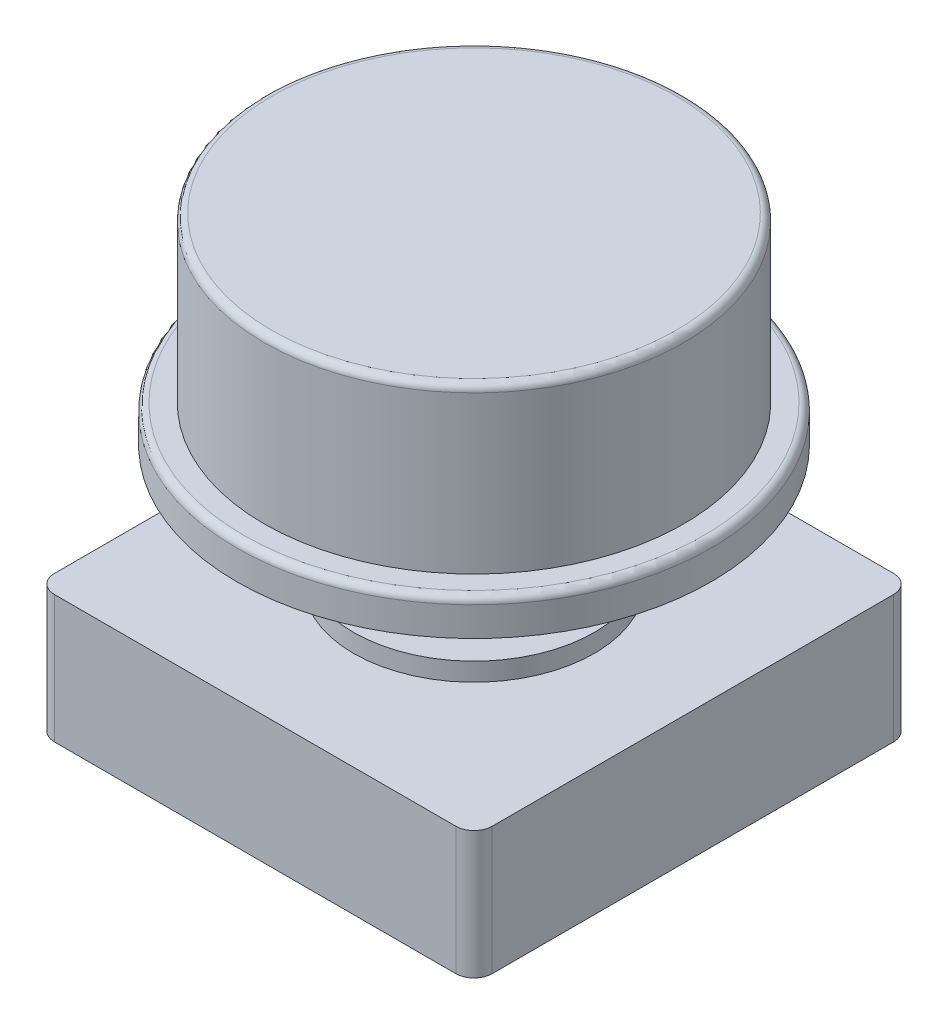
ISO-10303-21;
HEADER;
FILE_DESCRIPTION(('STEP AP214'),'2;1');
FILE_NAME('part.step','',(''),(''),'','','');
FILE_SCHEMA(('AUTOMOTIVE_DESIGN { 1 0 10303 214 1 1 1 1 }'));
ENDSEC;
DATA;
#1=APPLICATION_CONTEXT('core data for automotive mechanical design processes');
#2=APPLICATION_PROTOCOL_DEFINITION('international standard','automotive_design',2000,#1);
#3=PRODUCT_CONTEXT('',#1,'mechanical');
#4=PRODUCT('Part','Part','',(#3));
#5=PRODUCT_RELATED_PRODUCT_CATEGORY('part','',(#4));
#6=PRODUCT_DEFINITION_FORMATION('','',#4);
#7=PRODUCT_DEFINITION_CONTEXT('part definition',#1,'design');
#8=PRODUCT_DEFINITION('design','',#6,#7);
#9=PRODUCT_DEFINITION_SHAPE('','',#8);
#10=(LENGTH_UNIT() NAMED_UNIT(*) SI_UNIT(.MILLI.,.METRE.));
#11=(NAMED_UNIT(*) PLANE_ANGLE_UNIT() SI_UNIT($,.RADIAN.));
#12=(NAMED_UNIT(*) SI_UNIT($,.STERADIAN.) SOLID_ANGLE_UNIT());
#13=UNCERTAINTY_MEASURE_WITH_UNIT(LENGTH_MEASURE(1.E-05),#10,'distance_accuracy_value','');
#14=(GEOMETRIC_REPRESENTATION_CONTEXT(3) GLOBAL_UNCERTAINTY_ASSIGNED_CONTEXT((#13)) GLOBAL_UNIT_ASSIGNED_CONTEXT((#10,
#11,#12)) REPRESENTATION_CONTEXT('',''));
#15=CARTESIAN_POINT('',(0.,0.,0.));
#16=DIRECTION('',(0.,0.,1.));
#17=DIRECTION('',(1.,0.,0.));
#18=AXIS2_PLACEMENT_3D('',#15,#16,#17);
#19=CARTESIAN_POINT('',(-11.5,3.5,-0.499999999999999));
#20=DIRECTION('',(0.,-1.,0.));
#21=DIRECTION('',(0.,0.,-1.));
#22=AXIS2_PLACEMENT_3D('',#19,#20,#21);
#23=CYLINDRICAL_SURFACE('',#22,0.5);
#24=CARTESIAN_POINT('',(-11.5,0.,-0.499999999999999));
#25=DIRECTION('',(0.,-1.,0.));
#26=DIRECTION('',(0.,0.,-1.));
#27=AXIS2_PLACEMENT_3D('',#24,#25,#26);
#28=CIRCLE('',#27,0.5);
#29=CARTESIAN_POINT('',(-11.5,0.,0.));
#30=VERTEX_POINT('',#29);
#31=CARTESIAN_POINT('',(-12.,0.,-0.500000000000002));
#32=VERTEX_POINT('',#31);
#33=EDGE_CURVE('E163',#30,#32,#28,.T.);
#34=ORIENTED_EDGE('',*,*,#33,.F.);
#35=DIRECTION('',(0.,-1.,0.));
#36=VECTOR('',#35,1.);
#37=CARTESIAN_POINT('',(-11.5,3.5,0.));
#38=LINE('',#37,#36);
#39=CARTESIAN_POINT('',(-11.5,3.5,0.));
#40=VERTEX_POINT('',#39);
#41=EDGE_CURVE('E168',#40,#30,#38,.T.);
#42=ORIENTED_EDGE('',*,*,#41,.F.);
#43=CARTESIAN_POINT('',(-11.5,3.5,-0.499999999999999));
#44=DIRECTION('',(0.,-1.,0.));
#45=DIRECTION('',(0.,0.,-1.));
#46=AXIS2_PLACEMENT_3D('',#43,#44,#45);
#47=CIRCLE('',#46,0.5);
#48=CARTESIAN_POINT('',(-12.,3.5,-0.500000000000002));
#49=VERTEX_POINT('',#48);
#50=EDGE_CURVE('E169',#40,#49,#47,.T.);
#51=ORIENTED_EDGE('',*,*,#50,.T.);
#52=DIRECTION('',(0.,-1.,0.));
#53=VECTOR('',#52,1.);
#54=CARTESIAN_POINT('',(-12.,3.5,-0.500000000000002));
#55=LINE('',#54,#53);
#56=EDGE_CURVE('E190',#49,#32,#55,.T.);
#57=ORIENTED_EDGE('',*,*,#56,.T.);
#58=EDGE_LOOP('',(#34,#42,#51,#57));
#59=FACE_BOUND('',#58,.T.);
#60=ADVANCED_FACE('F33',(#59),#23,.T.);
#61=CARTESIAN_POINT('',(-0.500000000000004,3.5,0.));
#62=DIRECTION('',(0.,0.,1.));
#63=DIRECTION('',(1.,0.,0.));
#64=AXIS2_PLACEMENT_3D('',#61,#62,#63);
#65=PLANE('',#64);
#66=DIRECTION('',(-1.,0.,0.));
#67=VECTOR('',#66,1.);
#68=CARTESIAN_POINT('',(-0.500000000000004,0.,0.));
#69=LINE('',#68,#67);
#70=CARTESIAN_POINT('',(-0.500000000000004,0.,0.));
#71=VERTEX_POINT('',#70);
#72=EDGE_CURVE('E173',#71,#30,#69,.T.);
#73=ORIENTED_EDGE('',*,*,#72,.F.);
#74=DIRECTION('',(0.,-1.,0.));
#75=VECTOR('',#74,1.);
#76=CARTESIAN_POINT('',(-0.500000000000004,3.5,0.));
#77=LINE('',#76,#75);
#78=CARTESIAN_POINT('',(-0.500000000000004,3.5,0.));
#79=VERTEX_POINT('',#78);
#80=EDGE_CURVE('E212',#79,#71,#77,.T.);
#81=ORIENTED_EDGE('',*,*,#80,.F.);
#82=DIRECTION('',(-1.,0.,0.));
#83=VECTOR('',#82,1.);
#84=CARTESIAN_POINT('',(-0.500000000000004,3.5,0.));
#85=LINE('',#84,#83);
#86=EDGE_CURVE('E187',#79,#40,#85,.T.);
#87=ORIENTED_EDGE('',*,*,#86,.T.);
#88=ORIENTED_EDGE('',*,*,#41,.T.);
#89=EDGE_LOOP('',(#73,#81,#87,#88));
#90=FACE_BOUND('',#89,.T.);
#91=ADVANCED_FACE('F246',(#90),#65,.T.);
#92=CARTESIAN_POINT('',(-0.5,3.5,-0.5));
#93=DIRECTION('',(0.,-1.,0.));
#94=DIRECTION('',(0.,0.,-1.));
#95=AXIS2_PLACEMENT_3D('',#92,#93,#94);
#96=CYLINDRICAL_SURFACE('',#95,0.5);
#97=CARTESIAN_POINT('',(-0.5,0.,-0.5));
#98=DIRECTION('',(0.,1.,0.));
#99=DIRECTION('',(0.,0.,1.));
#100=AXIS2_PLACEMENT_3D('',#97,#98,#99);
#101=CIRCLE('',#100,0.5);
#102=CARTESIAN_POINT('',(0.,0.,-0.500000000000004));
#103=VERTEX_POINT('',#102);
#104=EDGE_CURVE('E207',#71,#103,#101,.T.);
#105=ORIENTED_EDGE('',*,*,#104,.T.);
#106=DIRECTION('',(0.,-1.,0.));
#107=VECTOR('',#106,1.);
#108=CARTESIAN_POINT('',(0.,3.5,-0.500000000000004));
#109=LINE('',#108,#107);
#110=CARTESIAN_POINT('',(0.,3.5,-0.500000000000004));
#111=VERTEX_POINT('',#110);
#112=EDGE_CURVE('E214',#111,#103,#109,.T.);
#113=ORIENTED_EDGE('',*,*,#112,.F.);
#114=CARTESIAN_POINT('',(-0.5,3.5,-0.5));
#115=DIRECTION('',(0.,1.,0.));
#116=DIRECTION('',(0.,0.,1.));
#117=AXIS2_PLACEMENT_3D('',#114,#115,#116);
#118=CIRCLE('',#117,0.5);
#119=EDGE_CURVE('E185',#79,#111,#118,.T.);
#120=ORIENTED_EDGE('',*,*,#119,.F.);
#121=ORIENTED_EDGE('',*,*,#80,.T.);
#122=EDGE_LOOP('',(#105,#113,#120,#121));
#123=FACE_BOUND('',#122,.T.);
#124=ADVANCED_FACE('F252',(#123),#96,.T.);
#125=CARTESIAN_POINT('',(0.,3.5,-0.500000000000004));
#126=DIRECTION('',(-1.,0.,0.));
#127=DIRECTION('',(0.,0.,1.));
#128=AXIS2_PLACEMENT_3D('',#125,#126,#127);
#129=PLANE('',#128);
#130=DIRECTION('',(0.,0.,-1.));
#131=VECTOR('',#130,1.);
#132=CARTESIAN_POINT('',(0.,0.,-0.500000000000004));
#133=LINE('',#132,#131);
#134=CARTESIAN_POINT('',(0.,0.,-11.5));
#135=VERTEX_POINT('',#134);
#136=EDGE_CURVE('E204',#103,#135,#133,.T.);
#137=ORIENTED_EDGE('',*,*,#136,.T.);
#138=DIRECTION('',(0.,-1.,0.));
#139=VECTOR('',#138,1.);
#140=CARTESIAN_POINT('',(0.,3.5,-11.5));
#141=LINE('',#140,#139);
#142=CARTESIAN_POINT('',(0.,3.5,-11.5));
#143=VERTEX_POINT('',#142);
#144=EDGE_CURVE('E217',#143,#135,#141,.T.);
#145=ORIENTED_EDGE('',*,*,#144,.F.);
#146=DIRECTION('',(0.,0.,-1.));
#147=VECTOR('',#146,1.);
#148=CARTESIAN_POINT('',(0.,3.5,-0.500000000000004));
#149=LINE('',#148,#147);
#150=EDGE_CURVE('E183',#111,#143,#149,.T.);
#151=ORIENTED_EDGE('',*,*,#150,.F.);
#152=ORIENTED_EDGE('',*,*,#112,.T.);
#153=EDGE_LOOP('',(#137,#145,#151,#152));
#154=FACE_BOUND('',#153,.T.);
#155=ADVANCED_FACE('F273',(#154),#129,.F.);
#156=CARTESIAN_POINT('',(-0.5,3.5,-11.5));
#157=DIRECTION('',(0.,-1.,0.));
#158=DIRECTION('',(0.,0.,-1.));
#159=AXIS2_PLACEMENT_3D('',#156,#157,#158);
#160=CYLINDRICAL_SURFACE('',#159,0.5);
#161=CARTESIAN_POINT('',(-0.5,0.,-11.5));
#162=DIRECTION('',(0.,-1.,0.));
#163=DIRECTION('',(0.,0.,-1.));
#164=AXIS2_PLACEMENT_3D('',#161,#162,#163);
#165=CIRCLE('',#164,0.5);
#166=CARTESIAN_POINT('',(-0.500000000000004,0.,-12.));
#167=VERTEX_POINT('',#166);
#168=EDGE_CURVE('E201',#167,#135,#165,.T.);
#169=ORIENTED_EDGE('',*,*,#168,.F.);
#170=DIRECTION('',(0.,-1.,0.));
#171=VECTOR('',#170,1.);
#172=CARTESIAN_POINT('',(-0.500000000000004,3.5,-12.));
#173=LINE('',#172,#171);
#174=CARTESIAN_POINT('',(-0.500000000000004,3.5,-12.));
#175=VERTEX_POINT('',#174);
#176=EDGE_CURVE('E219',#175,#167,#173,.T.);
#177=ORIENTED_EDGE('',*,*,#176,.F.);
#178=CARTESIAN_POINT('',(-0.5,3.5,-11.5));
#179=DIRECTION('',(0.,-1.,0.));
#180=DIRECTION('',(0.,0.,-1.));
#181=AXIS2_PLACEMENT_3D('',#178,#179,#180);
#182=CIRCLE('',#181,0.5);
#183=EDGE_CURVE('E180',#175,#143,#182,.T.);
#184=ORIENTED_EDGE('',*,*,#183,.T.);
#185=ORIENTED_EDGE('',*,*,#144,.T.);
#186=EDGE_LOOP('',(#169,#177,#184,#185));
#187=FACE_BOUND('',#186,.T.);
#188=ADVANCED_FACE('F269',(#187),#160,.T.);
#189=CARTESIAN_POINT('',(-0.500000000000004,3.5,-12.));
#190=DIRECTION('',(0.,0.,1.));
#191=DIRECTION('',(1.,0.,0.));
#192=AXIS2_PLACEMENT_3D('',#189,#190,#191);
#193=PLANE('',#192);
#194=DIRECTION('',(-1.,0.,0.));
#195=VECTOR('',#194,1.);
#196=CARTESIAN_POINT('',(-0.500000000000004,0.,-12.));
#197=LINE('',#196,#195);
#198=CARTESIAN_POINT('',(-11.5,0.,-12.));
#199=VERTEX_POINT('',#198);
#200=EDGE_CURVE('E199',#167,#199,#197,.T.);
#201=ORIENTED_EDGE('',*,*,#200,.T.);
#202=DIRECTION('',(0.,-1.,0.));
#203=VECTOR('',#202,1.);
#204=CARTESIAN_POINT('',(-11.5,3.5,-12.));
#205=LINE('',#204,#203);
#206=CARTESIAN_POINT('',(-11.5,3.5,-12.));
#207=VERTEX_POINT('',#206);
#208=EDGE_CURVE('E221',#207,#199,#205,.T.);
#209=ORIENTED_EDGE('',*,*,#208,.F.);
#210=DIRECTION('',(-1.,0.,0.));
#211=VECTOR('',#210,1.);
#212=CARTESIAN_POINT('',(-0.500000000000004,3.5,-12.));
#213=LINE('',#212,#211);
#214=EDGE_CURVE('E178',#175,#207,#213,.T.);
#215=ORIENTED_EDGE('',*,*,#214,.F.);
#216=ORIENTED_EDGE('',*,*,#176,.T.);
#217=EDGE_LOOP('',(#201,#209,#215,#216));
#218=FACE_BOUND('',#217,.T.);
#219=ADVANCED_FACE('F265',(#218),#193,.F.);
#220=CARTESIAN_POINT('',(-11.5,3.5,-11.5));
#221=DIRECTION('',(0.,-1.,0.));
#222=DIRECTION('',(0.,0.,-1.));
#223=AXIS2_PLACEMENT_3D('',#220,#221,#222);
#224=CYLINDRICAL_SURFACE('',#223,0.5);
#225=CARTESIAN_POINT('',(-11.5,0.,-11.5));
#226=DIRECTION('',(0.,1.,0.));
#227=DIRECTION('',(0.,0.,1.));
#228=AXIS2_PLACEMENT_3D('',#225,#226,#227);
#229=CIRCLE('',#228,0.5);
#230=CARTESIAN_POINT('',(-12.,0.,-11.5));
#231=VERTEX_POINT('',#230);
#232=EDGE_CURVE('E196',#199,#231,#229,.T.);
#233=ORIENTED_EDGE('',*,*,#232,.T.);
#234=DIRECTION('',(0.,-1.,0.));
#235=VECTOR('',#234,1.);
#236=CARTESIAN_POINT('',(-12.,3.5,-11.5));
#237=LINE('',#236,#235);
#238=CARTESIAN_POINT('',(-12.,3.5,-11.5));
#239=VERTEX_POINT('',#238);
#240=EDGE_CURVE('E224',#239,#231,#237,.T.);
#241=ORIENTED_EDGE('',*,*,#240,.F.);
#242=CARTESIAN_POINT('',(-11.5,3.5,-11.5));
#243=DIRECTION('',(0.,1.,0.));
#244=DIRECTION('',(0.,0.,1.));
#245=AXIS2_PLACEMENT_3D('',#242,#243,#244);
#246=CIRCLE('',#245,0.5);
#247=EDGE_CURVE('E176',#207,#239,#246,.T.);
#248=ORIENTED_EDGE('',*,*,#247,.F.);
#249=ORIENTED_EDGE('',*,*,#208,.T.);
#250=EDGE_LOOP('',(#233,#241,#248,#249));
#251=FACE_BOUND('',#250,.T.);
#252=ADVANCED_FACE('F261',(#251),#224,.T.);
#253=CARTESIAN_POINT('',(-12.,3.5,-0.500000000000002));
#254=DIRECTION('',(-1.,0.,0.));
#255=DIRECTION('',(0.,0.,1.));
#256=AXIS2_PLACEMENT_3D('',#253,#254,#255);
#257=PLANE('',#256);
#258=DIRECTION('',(0.,0.,-1.));
#259=VECTOR('',#258,1.);
#260=CARTESIAN_POINT('',(-12.,0.,-0.500000000000002));
#261=LINE('',#260,#259);
#262=EDGE_CURVE('E193',#32,#231,#261,.T.);
#263=ORIENTED_EDGE('',*,*,#262,.F.);
#264=ORIENTED_EDGE('',*,*,#56,.F.);
#265=DIRECTION('',(0.,0.,-1.));
#266=VECTOR('',#265,1.);
#267=CARTESIAN_POINT('',(-12.,3.5,-0.500000000000002));
#268=LINE('',#267,#266);
#269=EDGE_CURVE('E172',#49,#239,#268,.T.);
#270=ORIENTED_EDGE('',*,*,#269,.T.);
#271=ORIENTED_EDGE('',*,*,#240,.T.);
#272=EDGE_LOOP('',(#263,#264,#270,#271));
#273=FACE_BOUND('',#272,.T.);
#274=ADVANCED_FACE('F257',(#273),#257,.T.);
#275=CARTESIAN_POINT('',(-11.5,3.5,-0.499999999999999));
#276=DIRECTION('',(0.,-1.,0.));
#277=DIRECTION('',(0.,0.,-1.));
#278=AXIS2_PLACEMENT_3D('',#275,#276,#277);
#279=PLANE('',#278);
#280=CARTESIAN_POINT('',(-6.,3.5,-6.));
#281=DIRECTION('',(0.,1.,0.));
#282=DIRECTION('',(0.,0.,1.));
#283=AXIS2_PLACEMENT_3D('',#280,#281,#282);
#284=CIRCLE('',#283,3.3);
#285=CARTESIAN_POINT('',(-6.,3.5,-2.7));
#286=VERTEX_POINT('',#285);
#287=EDGE_CURVE('E164',#286,#286,#284,.T.);
#288=ORIENTED_EDGE('',*,*,#287,.F.);
#289=EDGE_LOOP('',(#288));
#290=FACE_BOUND('',#289,.T.);
#291=ORIENTED_EDGE('',*,*,#50,.F.);
#292=ORIENTED_EDGE('',*,*,#86,.F.);
#293=ORIENTED_EDGE('',*,*,#119,.T.);
#294=ORIENTED_EDGE('',*,*,#150,.T.);
#295=ORIENTED_EDGE('',*,*,#183,.F.);
#296=ORIENTED_EDGE('',*,*,#214,.T.);
#297=ORIENTED_EDGE('',*,*,#247,.T.);
#298=ORIENTED_EDGE('',*,*,#269,.F.);
#299=EDGE_LOOP('',(#291,#292,#293,#294,#295,#296,#297,#298));
#300=FACE_BOUND('',#299,.T.);
#301=ADVANCED_FACE('F260',(#290,#300),#279,.F.);
#302=CARTESIAN_POINT('',(-11.5,0.,-0.499999999999999));
#303=DIRECTION('',(0.,-1.,0.));
#304=DIRECTION('',(0.,0.,-1.));
#305=AXIS2_PLACEMENT_3D('',#302,#303,#304);
#306=PLANE('',#305);
#307=ORIENTED_EDGE('',*,*,#33,.T.);
#308=ORIENTED_EDGE('',*,*,#262,.T.);
#309=ORIENTED_EDGE('',*,*,#232,.F.);
#310=ORIENTED_EDGE('',*,*,#200,.F.);
#311=ORIENTED_EDGE('',*,*,#168,.T.);
#312=ORIENTED_EDGE('',*,*,#136,.F.);
#313=ORIENTED_EDGE('',*,*,#104,.F.);
#314=ORIENTED_EDGE('',*,*,#72,.T.);
#315=EDGE_LOOP('',(#307,#308,#309,#310,#311,#312,#313,#314));
#316=FACE_BOUND('',#315,.T.);
#317=ADVANCED_FACE('F281',(#316),#306,.T.);
#318=CARTESIAN_POINT('',(-6.,4.,-6.));
#319=DIRECTION('',(0.,-1.,0.));
#320=DIRECTION('',(0.,0.,-1.));
#321=AXIS2_PLACEMENT_3D('',#318,#319,#320);
#322=CYLINDRICAL_SURFACE('',#321,3.3);
#323=CARTESIAN_POINT('',(-6.,4.,-6.));
#324=DIRECTION('',(0.,1.,0.));
#325=DIRECTION('',(0.,0.,1.));
#326=AXIS2_PLACEMENT_3D('',#323,#324,#325);
#327=CIRCLE('',#326,3.3);
#328=CARTESIAN_POINT('',(-6.,4.,-2.7));
#329=VERTEX_POINT('',#328);
#330=EDGE_CURVE('E160',#329,#329,#327,.T.);
#331=ORIENTED_EDGE('',*,*,#330,.F.);
#332=EDGE_LOOP('',(#331));
#333=FACE_BOUND('',#332,.T.);
#334=ORIENTED_EDGE('',*,*,#287,.T.);
#335=EDGE_LOOP('',(#334));
#336=FACE_BOUND('',#335,.T.);
#337=ADVANCED_FACE('F284',(#333,#336),#322,.T.);
#338=CARTESIAN_POINT('',(-6.,4.,-6.));
#339=DIRECTION('',(0.,1.,0.));
#340=DIRECTION('',(0.,0.,1.));
#341=AXIS2_PLACEMENT_3D('',#338,#339,#340);
#342=PLANE('',#341);
#343=DIRECTION('',(0.,0.,1.));
#344=VECTOR('',#343,1.);
#345=CARTESIAN_POINT('',(-7.5,4.,-7.5));
#346=LINE('',#345,#344);
#347=CARTESIAN_POINT('',(-7.5,4.,-7.5));
#348=VERTEX_POINT('',#347);
#349=CARTESIAN_POINT('',(-7.5,4.,-4.5));
#350=VERTEX_POINT('',#349);
#351=EDGE_CURVE('E48',#348,#350,#346,.T.);
#352=ORIENTED_EDGE('',*,*,#351,.F.);
#353=DIRECTION('',(-1.,0.,0.));
#354=VECTOR('',#353,1.);
#355=CARTESIAN_POINT('',(-7.5,4.,-7.5));
#356=LINE('',#355,#354);
#357=CARTESIAN_POINT('',(-4.5,4.,-7.5));
#358=VERTEX_POINT('',#357);
#359=EDGE_CURVE('E52',#358,#348,#356,.T.);
#360=ORIENTED_EDGE('',*,*,#359,.F.);
#361=DIRECTION('',(0.,0.,-1.));
#362=VECTOR('',#361,1.);
#363=CARTESIAN_POINT('',(-4.5,4.,-7.5));
#364=LINE('',#363,#362);
#365=CARTESIAN_POINT('',(-4.5,4.,-4.5));
#366=VERTEX_POINT('',#365);
#367=EDGE_CURVE('E152',#366,#358,#364,.T.);
#368=ORIENTED_EDGE('',*,*,#367,.F.);
#369=DIRECTION('',(1.,0.,0.));
#370=VECTOR('',#369,1.);
#371=CARTESIAN_POINT('',(-7.5,4.,-4.5));
#372=LINE('',#371,#370);
#373=EDGE_CURVE('E148',#350,#366,#372,.T.);
#374=ORIENTED_EDGE('',*,*,#373,.F.);
#375=EDGE_LOOP('',(#352,#360,#368,#374));
#376=FACE_BOUND('',#375,.T.);
#377=ORIENTED_EDGE('',*,*,#330,.T.);
#378=EDGE_LOOP('',(#377));
#379=FACE_BOUND('',#378,.T.);
#380=ADVANCED_FACE('F291',(#376,#379),#342,.T.);
#381=CARTESIAN_POINT('',(-7.5,6.8,-7.5));
#382=DIRECTION('',(1.,0.,0.));
#383=DIRECTION('',(0.,0.,-1.));
#384=AXIS2_PLACEMENT_3D('',#381,#382,#383);
#385=PLANE('',#384);
#386=ORIENTED_EDGE('',*,*,#351,.T.);
#387=DIRECTION('',(0.,-1.,0.));
#388=VECTOR('',#387,1.);
#389=CARTESIAN_POINT('',(-7.5,6.8,-4.5));
#390=LINE('',#389,#388);
#391=CARTESIAN_POINT('',(-7.5,6.8,-4.5));
#392=VERTEX_POINT('',#391);
#393=EDGE_CURVE('E126',#392,#350,#390,.T.);
#394=ORIENTED_EDGE('',*,*,#393,.F.);
#395=DIRECTION('',(0.,0.,1.));
#396=VECTOR('',#395,1.);
#397=CARTESIAN_POINT('',(-7.5,6.8,-7.5));
#398=LINE('',#397,#396);
#399=CARTESIAN_POINT('',(-7.5,6.8,-7.5));
#400=VERTEX_POINT('',#399);
#401=EDGE_CURVE('E121',#400,#392,#398,.T.);
#402=ORIENTED_EDGE('',*,*,#401,.F.);
#403=DIRECTION('',(0.,-1.,0.));
#404=VECTOR('',#403,1.);
#405=CARTESIAN_POINT('',(-7.5,6.8,-7.5));
#406=LINE('',#405,#404);
#407=EDGE_CURVE('E124',#400,#348,#406,.T.);
#408=ORIENTED_EDGE('',*,*,#407,.T.);
#409=EDGE_LOOP('',(#386,#394,#402,#408));
#410=FACE_BOUND('',#409,.T.);
#411=ADVANCED_FACE('F123',(#410),#385,.F.);
#412=CARTESIAN_POINT('',(-7.5,6.8,-4.5));
#413=DIRECTION('',(0.,0.,-1.));
#414=DIRECTION('',(-1.,0.,0.));
#415=AXIS2_PLACEMENT_3D('',#412,#413,#414);
#416=PLANE('',#415);
#417=ORIENTED_EDGE('',*,*,#373,.T.);
#418=DIRECTION('',(0.,-1.,0.));
#419=VECTOR('',#418,1.);
#420=CARTESIAN_POINT('',(-4.5,6.8,-4.5));
#421=LINE('',#420,#419);
#422=CARTESIAN_POINT('',(-4.5,6.8,-4.5));
#423=VERTEX_POINT('',#422);
#424=EDGE_CURVE('E156',#423,#366,#421,.T.);
#425=ORIENTED_EDGE('',*,*,#424,.F.);
#426=DIRECTION('',(1.,0.,0.));
#427=VECTOR('',#426,1.);
#428=CARTESIAN_POINT('',(-7.5,6.8,-4.5));
#429=LINE('',#428,#427);
#430=EDGE_CURVE('E130',#392,#423,#429,.T.);
#431=ORIENTED_EDGE('',*,*,#430,.F.);
#432=ORIENTED_EDGE('',*,*,#393,.T.);
#433=EDGE_LOOP('',(#417,#425,#431,#432));
#434=FACE_BOUND('',#433,.T.);
#435=ADVANCED_FACE('F297',(#434),#416,.F.);
#436=CARTESIAN_POINT('',(-4.5,6.8,-7.5));
#437=DIRECTION('',(-1.,0.,0.));
#438=DIRECTION('',(0.,0.,1.));
#439=AXIS2_PLACEMENT_3D('',#436,#437,#438);
#440=PLANE('',#439);
#441=ORIENTED_EDGE('',*,*,#367,.T.);
#442=DIRECTION('',(0.,-1.,0.));
#443=VECTOR('',#442,1.);
#444=CARTESIAN_POINT('',(-4.5,6.8,-7.5));
#445=LINE('',#444,#443);
#446=CARTESIAN_POINT('',(-4.5,6.8,-7.5));
#447=VERTEX_POINT('',#446);
#448=EDGE_CURVE('E138',#447,#358,#445,.T.);
#449=ORIENTED_EDGE('',*,*,#448,.F.);
#450=DIRECTION('',(0.,0.,-1.));
#451=VECTOR('',#450,1.);
#452=CARTESIAN_POINT('',(-4.5,6.8,-7.5));
#453=LINE('',#452,#451);
#454=EDGE_CURVE('E142',#423,#447,#453,.T.);
#455=ORIENTED_EDGE('',*,*,#454,.F.);
#456=ORIENTED_EDGE('',*,*,#424,.T.);
#457=EDGE_LOOP('',(#441,#449,#455,#456));
#458=FACE_BOUND('',#457,.T.);
#459=ADVANCED_FACE('F300',(#458),#440,.F.);
#460=CARTESIAN_POINT('',(-7.5,6.8,-7.5));
#461=DIRECTION('',(0.,0.,1.));
#462=DIRECTION('',(1.,0.,0.));
#463=AXIS2_PLACEMENT_3D('',#460,#461,#462);
#464=PLANE('',#463);
#465=ORIENTED_EDGE('',*,*,#359,.T.);
#466=ORIENTED_EDGE('',*,*,#407,.F.);
#467=DIRECTION('',(-1.,0.,0.));
#468=VECTOR('',#467,1.);
#469=CARTESIAN_POINT('',(-7.5,6.8,-7.5));
#470=LINE('',#469,#468);
#471=EDGE_CURVE('E136',#447,#400,#470,.T.);
#472=ORIENTED_EDGE('',*,*,#471,.F.);
#473=ORIENTED_EDGE('',*,*,#448,.T.);
#474=EDGE_LOOP('',(#465,#466,#472,#473));
#475=FACE_BOUND('',#474,.T.);
#476=ADVANCED_FACE('F134',(#475),#464,.F.);
#477=CARTESIAN_POINT('',(-6.,6.8,-6.));
#478=DIRECTION('',(0.,1.,0.));
#479=DIRECTION('',(0.,0.,1.));
#480=AXIS2_PLACEMENT_3D('',#477,#478,#479);
#481=PLANE('',#480);
#482=CARTESIAN_POINT('',(-6.,6.8,-6.));
#483=DIRECTION('',(0.,1.,0.));
#484=DIRECTION('',(0.,0.,1.));
#485=AXIS2_PLACEMENT_3D('',#482,#483,#484);
#486=CIRCLE('',#485,6.5);
#487=CARTESIAN_POINT('',(-6.,6.8,0.500000000000003));
#488=VERTEX_POINT('',#487);
#489=EDGE_CURVE('E149',#488,#488,#486,.T.);
#490=ORIENTED_EDGE('',*,*,#489,.F.);
#491=EDGE_LOOP('',(#490));
#492=FACE_BOUND('',#491,.T.);
#493=ORIENTED_EDGE('',*,*,#471,.T.);
#494=ORIENTED_EDGE('',*,*,#401,.T.);
#495=ORIENTED_EDGE('',*,*,#430,.T.);
#496=ORIENTED_EDGE('',*,*,#454,.T.);
#497=EDGE_LOOP('',(#493,#494,#495,#496));
#498=FACE_BOUND('',#497,.T.);
#499=ADVANCED_FACE('F140',(#492,#498),#481,.F.);
#500=CARTESIAN_POINT('',(-6.,7.8,-6.));
#501=DIRECTION('',(0.,-1.,0.));
#502=DIRECTION('',(0.,0.,-1.));
#503=AXIS2_PLACEMENT_3D('',#500,#501,#502);
#504=CYLINDRICAL_SURFACE('',#503,6.5);
#505=CARTESIAN_POINT('',(-6.,7.6,-6.));
#506=DIRECTION('',(0.,1.,0.));
#507=DIRECTION('',(0.,0.,1.));
#508=AXIS2_PLACEMENT_3D('',#505,#506,#507);
#509=CIRCLE('',#508,6.5);
#510=CARTESIAN_POINT('',(-6.,7.6,0.500000000000003));
#511=VERTEX_POINT('',#510);
#512=EDGE_CURVE('E230',#511,#511,#509,.F.);
#513=ORIENTED_EDGE('',*,*,#512,.T.);
#514=EDGE_LOOP('',(#513));
#515=FACE_BOUND('',#514,.T.);
#516=ORIENTED_EDGE('',*,*,#489,.T.);
#517=EDGE_LOOP('',(#516));
#518=FACE_BOUND('',#517,.T.);
#519=ADVANCED_FACE('F307',(#515,#518),#504,.T.);
#520=CARTESIAN_POINT('',(-6.,7.8,-6.));
#521=DIRECTION('',(0.,1.,0.));
#522=DIRECTION('',(0.,0.,1.));
#523=AXIS2_PLACEMENT_3D('',#520,#521,#522);
#524=PLANE('',#523);
#525=CARTESIAN_POINT('',(-6.,7.8,-6.));
#526=DIRECTION('',(0.,1.,0.));
#527=DIRECTION('',(0.,0.,1.));
#528=AXIS2_PLACEMENT_3D('',#525,#526,#527);
#529=CIRCLE('',#528,6.3);
#530=CARTESIAN_POINT('',(-6.,7.8,0.300000000000003));
#531=VERTEX_POINT('',#530);
#532=EDGE_CURVE('E227',#531,#531,#529,.T.);
#533=ORIENTED_EDGE('',*,*,#532,.T.);
#534=EDGE_LOOP('',(#533));
#535=FACE_BOUND('',#534,.T.);
#536=CARTESIAN_POINT('',(-6.,7.8,-6.));
#537=DIRECTION('',(0.,1.,0.));
#538=DIRECTION('',(0.,0.,1.));
#539=AXIS2_PLACEMENT_3D('',#536,#537,#538);
#540=CIRCLE('',#539,5.75);
#541=CARTESIAN_POINT('',(-6.,7.8,-0.249999999999997));
#542=VERTEX_POINT('',#541);
#543=EDGE_CURVE('E167',#542,#542,#540,.T.);
#544=ORIENTED_EDGE('',*,*,#543,.F.);
#545=EDGE_LOOP('',(#544));
#546=FACE_BOUND('',#545,.T.);
#547=ADVANCED_FACE('F310',(#535,#546),#524,.T.);
#548=CARTESIAN_POINT('',(-6.,12.3,-6.));
#549=DIRECTION('',(0.,-1.,0.));
#550=DIRECTION('',(0.,0.,-1.));
#551=AXIS2_PLACEMENT_3D('',#548,#549,#550);
#552=CYLINDRICAL_SURFACE('',#551,5.75);
#553=CARTESIAN_POINT('',(-6.,12.1,-6.));
#554=DIRECTION('',(0.,1.,0.));
#555=DIRECTION('',(0.,0.,1.));
#556=AXIS2_PLACEMENT_3D('',#553,#554,#555);
#557=CIRCLE('',#556,5.75);
#558=CARTESIAN_POINT('',(-6.,12.1,-0.249999999999997));
#559=VERTEX_POINT('',#558);
#560=EDGE_CURVE('E11',#559,#559,#557,.F.);
#561=ORIENTED_EDGE('',*,*,#560,.T.);
#562=EDGE_LOOP('',(#561));
#563=FACE_BOUND('',#562,.T.);
#564=ORIENTED_EDGE('',*,*,#543,.T.);
#565=EDGE_LOOP('',(#564));
#566=FACE_BOUND('',#565,.T.);
#567=ADVANCED_FACE('F317',(#563,#566),#552,.T.);
#568=CARTESIAN_POINT('',(-6.,12.3,-6.));
#569=DIRECTION('',(0.,1.,0.));
#570=DIRECTION('',(0.,0.,1.));
#571=AXIS2_PLACEMENT_3D('',#568,#569,#570);
#572=PLANE('',#571);
#573=CARTESIAN_POINT('',(-6.,12.3,-6.));
#574=DIRECTION('',(0.,1.,0.));
#575=DIRECTION('',(0.,0.,1.));
#576=AXIS2_PLACEMENT_3D('',#573,#574,#575);
#577=CIRCLE('',#576,5.55);
#578=CARTESIAN_POINT('',(-6.,12.3,-0.449999999999996));
#579=VERTEX_POINT('',#578);
#580=EDGE_CURVE('E41',#579,#579,#577,.T.);
#581=ORIENTED_EDGE('',*,*,#580,.T.);
#582=EDGE_LOOP('',(#581));
#583=FACE_BOUND('',#582,.T.);
#584=ADVANCED_FACE('F235',(#583),#572,.T.);
#585=CARTESIAN_POINT('',(-6.,7.6,-6.));
#586=DIRECTION('',(0.,1.,0.));
#587=DIRECTION('',(0.,0.,1.));
#588=AXIS2_PLACEMENT_3D('',#585,#586,#587);
#589=TOROIDAL_SURFACE('',#588,6.3,0.2);
#590=ORIENTED_EDGE('',*,*,#512,.F.);
#591=EDGE_LOOP('',(#590));
#592=FACE_BOUND('',#591,.T.);
#593=ORIENTED_EDGE('',*,*,#532,.F.);
#594=EDGE_LOOP('',(#593));
#595=FACE_BOUND('',#594,.T.);
#596=ADVANCED_FACE('F238',(#592,#595),#589,.T.);
#597=CARTESIAN_POINT('',(-6.,12.1,-6.));
#598=DIRECTION('',(0.,1.,0.));
#599=DIRECTION('',(0.,0.,1.));
#600=AXIS2_PLACEMENT_3D('',#597,#598,#599);
#601=TOROIDAL_SURFACE('',#600,5.55,0.2);
#602=ORIENTED_EDGE('',*,*,#560,.F.);
#603=EDGE_LOOP('',(#602));
#604=FACE_BOUND('',#603,.T.);
#605=ORIENTED_EDGE('',*,*,#580,.F.);
#606=EDGE_LOOP('',(#605));
#607=FACE_BOUND('',#606,.T.);
#608=ADVANCED_FACE('F35',(#604,#607),#601,.T.);
#609=CLOSED_SHELL('',(#60,#91,#124,#155,#188,#219,#252,#274,#301,#317,#337,#380,#411,#435,#459,
#476,#499,#519,#547,#567,#584,#596,#608));
#610=MANIFOLD_SOLID_BREP('B2',#609);
#611=ADVANCED_BREP_SHAPE_REPRESENTATION('',(#18,#610),#14);
#612=SHAPE_DEFINITION_REPRESENTATION(#9,#611);
ENDSEC;
END-ISO-10303-21;
